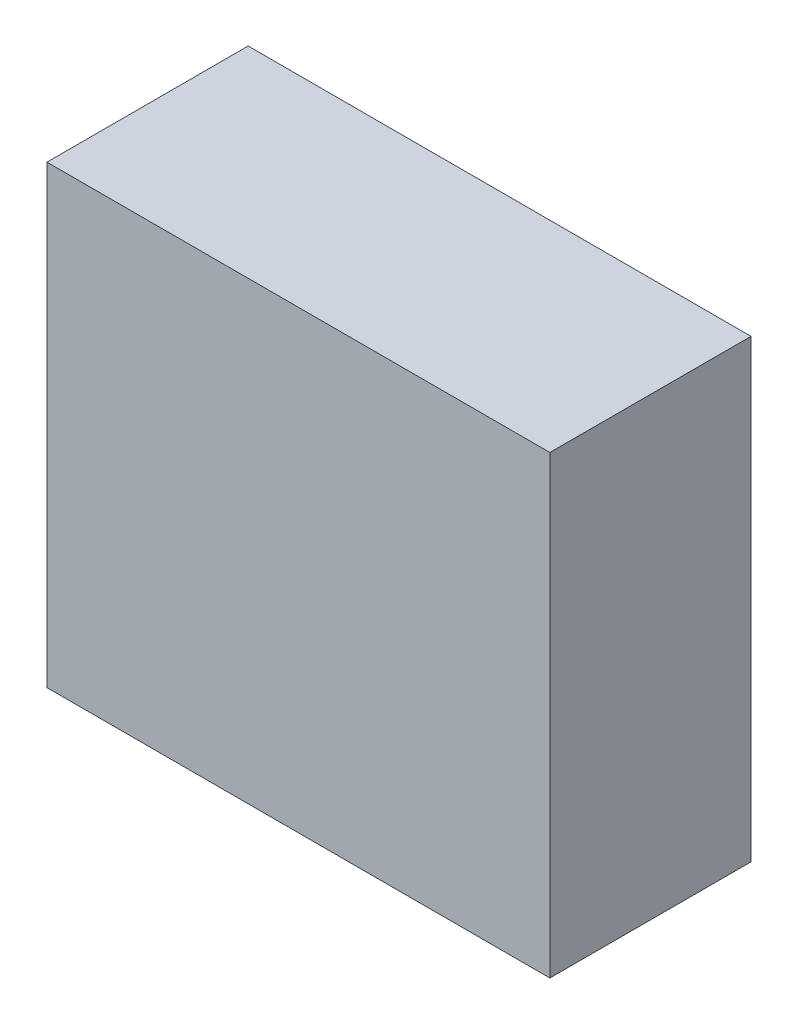
ISO-10303-21;
HEADER;
FILE_DESCRIPTION(('STEP AP214'),'2;1');
FILE_NAME('part.step','',(''),(''),'','','');
FILE_SCHEMA(('AUTOMOTIVE_DESIGN { 1 0 10303 214 1 1 1 1 }'));
ENDSEC;
DATA;
#1=APPLICATION_CONTEXT('core data for automotive mechanical design processes');
#2=APPLICATION_PROTOCOL_DEFINITION('international standard','automotive_design',2000,#1);
#3=PRODUCT_CONTEXT('',#1,'mechanical');
#4=PRODUCT('Part','Part','',(#3));
#5=PRODUCT_RELATED_PRODUCT_CATEGORY('part','',(#4));
#6=PRODUCT_DEFINITION_FORMATION('','',#4);
#7=PRODUCT_DEFINITION_CONTEXT('part definition',#1,'design');
#8=PRODUCT_DEFINITION('design','',#6,#7);
#9=PRODUCT_DEFINITION_SHAPE('','',#8);
#10=(LENGTH_UNIT() NAMED_UNIT(*) SI_UNIT(.MILLI.,.METRE.));
#11=(NAMED_UNIT(*) PLANE_ANGLE_UNIT() SI_UNIT($,.RADIAN.));
#12=(NAMED_UNIT(*) SI_UNIT($,.STERADIAN.) SOLID_ANGLE_UNIT());
#13=UNCERTAINTY_MEASURE_WITH_UNIT(LENGTH_MEASURE(1.E-05),#10,'distance_accuracy_value','');
#14=(GEOMETRIC_REPRESENTATION_CONTEXT(3) GLOBAL_UNCERTAINTY_ASSIGNED_CONTEXT((#13)) GLOBAL_UNIT_ASSIGNED_CONTEXT((#10,
#11,#12)) REPRESENTATION_CONTEXT('',''));
#15=CARTESIAN_POINT('',(0.,0.,0.));
#16=DIRECTION('',(0.,0.,1.));
#17=DIRECTION('',(1.,0.,0.));
#18=AXIS2_PLACEMENT_3D('',#15,#16,#17);
#19=CARTESIAN_POINT('',(-12.6330612244898,-10.9338775510204,8.));
#20=DIRECTION('',(1.,0.,0.));
#21=DIRECTION('',(0.,0.,-1.));
#22=AXIS2_PLACEMENT_3D('',#19,#20,#21);
#23=PLANE('',#22);
#24=DIRECTION('',(0.,-1.,0.));
#25=VECTOR('',#24,1.);
#26=CARTESIAN_POINT('',(-12.6330612244898,-10.9338775510204,0.));
#27=LINE('',#26,#25);
#28=CARTESIAN_POINT('',(-12.6330612244898,7.16612244897959,0.));
#29=VERTEX_POINT('',#28);
#30=CARTESIAN_POINT('',(-12.6330612244898,-10.9338775510204,0.));
#31=VERTEX_POINT('',#30);
#32=EDGE_CURVE('E96',#29,#31,#27,.T.);
#33=ORIENTED_EDGE('',*,*,#32,.T.);
#34=DIRECTION('',(0.,0.,-1.));
#35=VECTOR('',#34,1.);
#36=CARTESIAN_POINT('',(-12.6330612244898,-10.9338775510204,8.));
#37=LINE('',#36,#35);
#38=CARTESIAN_POINT('',(-12.6330612244898,-10.9338775510204,8.));
#39=VERTEX_POINT('',#38);
#40=EDGE_CURVE('E11',#39,#31,#37,.T.);
#41=ORIENTED_EDGE('',*,*,#40,.F.);
#42=DIRECTION('',(0.,-1.,0.));
#43=VECTOR('',#42,1.);
#44=CARTESIAN_POINT('',(-12.6330612244898,-10.9338775510204,8.));
#45=LINE('',#44,#43);
#46=CARTESIAN_POINT('',(-12.6330612244898,7.16612244897959,8.));
#47=VERTEX_POINT('',#46);
#48=EDGE_CURVE('E84',#47,#39,#45,.T.);
#49=ORIENTED_EDGE('',*,*,#48,.F.);
#50=DIRECTION('',(0.,0.,-1.));
#51=VECTOR('',#50,1.);
#52=CARTESIAN_POINT('',(-12.6330612244898,7.16612244897959,8.));
#53=LINE('',#52,#51);
#54=EDGE_CURVE('E92',#47,#29,#53,.T.);
#55=ORIENTED_EDGE('',*,*,#54,.T.);
#56=EDGE_LOOP('',(#33,#41,#49,#55));
#57=FACE_BOUND('',#56,.T.);
#58=ADVANCED_FACE('F33',(#57),#23,.F.);
#59=CARTESIAN_POINT('',(-12.6330612244898,-10.9338775510204,8.));
#60=DIRECTION('',(0.,1.,0.));
#61=DIRECTION('',(0.,0.,1.));
#62=AXIS2_PLACEMENT_3D('',#59,#60,#61);
#63=PLANE('',#62);
#64=DIRECTION('',(1.,0.,0.));
#65=VECTOR('',#64,1.);
#66=CARTESIAN_POINT('',(-12.6330612244898,-10.9338775510204,0.));
#67=LINE('',#66,#65);
#68=CARTESIAN_POINT('',(7.3669387755102,-10.9338775510204,0.));
#69=VERTEX_POINT('',#68);
#70=EDGE_CURVE('E88',#31,#69,#67,.T.);
#71=ORIENTED_EDGE('',*,*,#70,.T.);
#72=DIRECTION('',(0.,0.,-1.));
#73=VECTOR('',#72,1.);
#74=CARTESIAN_POINT('',(7.3669387755102,-10.9338775510204,8.));
#75=LINE('',#74,#73);
#76=CARTESIAN_POINT('',(7.3669387755102,-10.9338775510204,8.));
#77=VERTEX_POINT('',#76);
#78=EDGE_CURVE('E41',#77,#69,#75,.T.);
#79=ORIENTED_EDGE('',*,*,#78,.F.);
#80=DIRECTION('',(1.,0.,0.));
#81=VECTOR('',#80,1.);
#82=CARTESIAN_POINT('',(-12.6330612244898,-10.9338775510204,8.));
#83=LINE('',#82,#81);
#84=EDGE_CURVE('E79',#39,#77,#83,.T.);
#85=ORIENTED_EDGE('',*,*,#84,.F.);
#86=ORIENTED_EDGE('',*,*,#40,.T.);
#87=EDGE_LOOP('',(#71,#79,#85,#86));
#88=FACE_BOUND('',#87,.T.);
#89=ADVANCED_FACE('F87',(#88),#63,.F.);
#90=CARTESIAN_POINT('',(7.3669387755102,-10.9338775510204,8.));
#91=DIRECTION('',(-1.,0.,0.));
#92=DIRECTION('',(0.,0.,1.));
#93=AXIS2_PLACEMENT_3D('',#90,#91,#92);
#94=PLANE('',#93);
#95=DIRECTION('',(0.,1.,0.));
#96=VECTOR('',#95,1.);
#97=CARTESIAN_POINT('',(7.3669387755102,-10.9338775510204,0.));
#98=LINE('',#97,#96);
#99=CARTESIAN_POINT('',(7.3669387755102,7.16612244897959,0.));
#100=VERTEX_POINT('',#99);
#101=EDGE_CURVE('E66',#69,#100,#98,.T.);
#102=ORIENTED_EDGE('',*,*,#101,.T.);
#103=DIRECTION('',(0.,0.,-1.));
#104=VECTOR('',#103,1.);
#105=CARTESIAN_POINT('',(7.3669387755102,7.16612244897959,8.));
#106=LINE('',#105,#104);
#107=CARTESIAN_POINT('',(7.3669387755102,7.16612244897959,8.));
#108=VERTEX_POINT('',#107);
#109=EDGE_CURVE('E89',#108,#100,#106,.T.);
#110=ORIENTED_EDGE('',*,*,#109,.F.);
#111=DIRECTION('',(0.,1.,0.));
#112=VECTOR('',#111,1.);
#113=CARTESIAN_POINT('',(7.3669387755102,-10.9338775510204,8.));
#114=LINE('',#113,#112);
#115=EDGE_CURVE('E82',#77,#108,#114,.T.);
#116=ORIENTED_EDGE('',*,*,#115,.F.);
#117=ORIENTED_EDGE('',*,*,#78,.T.);
#118=EDGE_LOOP('',(#102,#110,#116,#117));
#119=FACE_BOUND('',#118,.T.);
#120=ADVANCED_FACE('F90',(#119),#94,.F.);
#121=CARTESIAN_POINT('',(-12.6330612244898,7.16612244897959,8.));
#122=DIRECTION('',(0.,-1.,0.));
#123=DIRECTION('',(0.,0.,-1.));
#124=AXIS2_PLACEMENT_3D('',#121,#122,#123);
#125=PLANE('',#124);
#126=DIRECTION('',(-1.,0.,0.));
#127=VECTOR('',#126,1.);
#128=CARTESIAN_POINT('',(-12.6330612244898,7.16612244897959,0.));
#129=LINE('',#128,#127);
#130=EDGE_CURVE('E72',#100,#29,#129,.T.);
#131=ORIENTED_EDGE('',*,*,#130,.T.);
#132=ORIENTED_EDGE('',*,*,#54,.F.);
#133=DIRECTION('',(-1.,0.,0.));
#134=VECTOR('',#133,1.);
#135=CARTESIAN_POINT('',(-12.6330612244898,7.16612244897959,8.));
#136=LINE('',#135,#134);
#137=EDGE_CURVE('E49',#108,#47,#136,.T.);
#138=ORIENTED_EDGE('',*,*,#137,.F.);
#139=ORIENTED_EDGE('',*,*,#109,.T.);
#140=EDGE_LOOP('',(#131,#132,#138,#139));
#141=FACE_BOUND('',#140,.T.);
#142=ADVANCED_FACE('F103',(#141),#125,.F.);
#143=CARTESIAN_POINT('',(0.,0.,8.));
#144=DIRECTION('',(0.,0.,-1.));
#145=DIRECTION('',(-1.,0.,0.));
#146=AXIS2_PLACEMENT_3D('',#143,#144,#145);
#147=PLANE('',#146);
#148=ORIENTED_EDGE('',*,*,#48,.T.);
#149=ORIENTED_EDGE('',*,*,#84,.T.);
#150=ORIENTED_EDGE('',*,*,#115,.T.);
#151=ORIENTED_EDGE('',*,*,#137,.T.);
#152=EDGE_LOOP('',(#148,#149,#150,#151));
#153=FACE_BOUND('',#152,.T.);
#154=ADVANCED_FACE('F80',(#153),#147,.F.);
#155=CARTESIAN_POINT('',(0.,0.,0.));
#156=DIRECTION('',(0.,0.,-1.));
#157=DIRECTION('',(-1.,0.,0.));
#158=AXIS2_PLACEMENT_3D('',#155,#156,#157);
#159=PLANE('',#158);
#160=ORIENTED_EDGE('',*,*,#32,.F.);
#161=ORIENTED_EDGE('',*,*,#130,.F.);
#162=ORIENTED_EDGE('',*,*,#101,.F.);
#163=ORIENTED_EDGE('',*,*,#70,.F.);
#164=EDGE_LOOP('',(#160,#161,#162,#163));
#165=FACE_BOUND('',#164,.T.);
#166=ADVANCED_FACE('F106',(#165),#159,.T.);
#167=CLOSED_SHELL('',(#58,#89,#120,#142,#154,#166));
#168=MANIFOLD_SOLID_BREP('B2',#167);
#169=ADVANCED_BREP_SHAPE_REPRESENTATION('',(#18,#168),#14);
#170=SHAPE_DEFINITION_REPRESENTATION(#9,#169);
ENDSEC;
END-ISO-10303-21;
